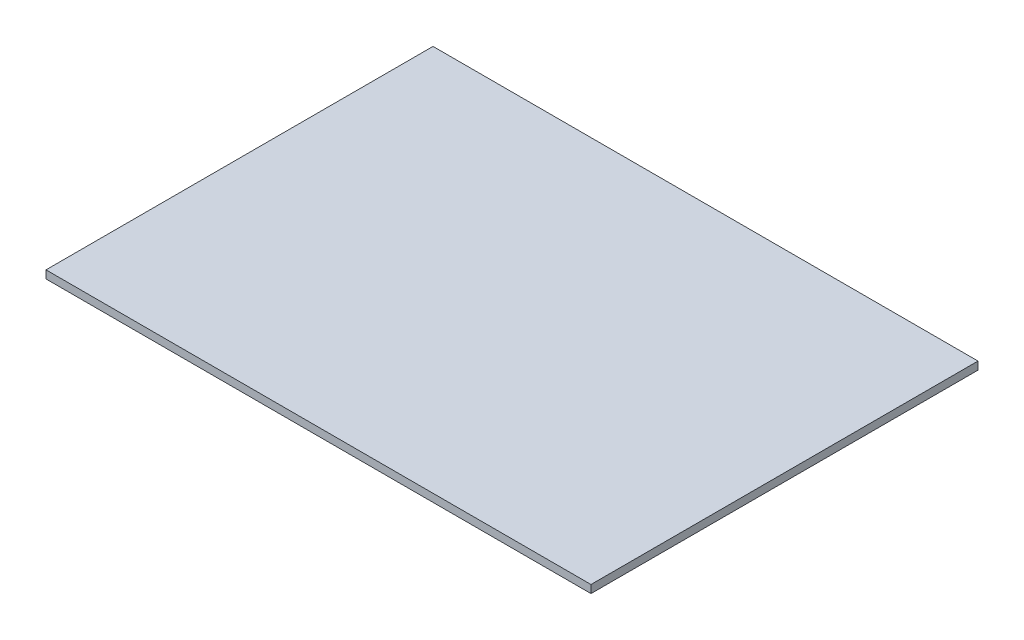
ISO-10303-21;
HEADER;
FILE_DESCRIPTION(('STEP AP214'),'2;1');
FILE_NAME('part.step','',(''),(''),'','','');
FILE_SCHEMA(('AUTOMOTIVE_DESIGN { 1 0 10303 214 1 1 1 1 }'));
ENDSEC;
DATA;
#1=APPLICATION_CONTEXT('core data for automotive mechanical design processes');
#2=APPLICATION_PROTOCOL_DEFINITION('international standard','automotive_design',2000,#1);
#3=PRODUCT_CONTEXT('',#1,'mechanical');
#4=PRODUCT('Part','Part','',(#3));
#5=PRODUCT_RELATED_PRODUCT_CATEGORY('part','',(#4));
#6=PRODUCT_DEFINITION_FORMATION('','',#4);
#7=PRODUCT_DEFINITION_CONTEXT('part definition',#1,'design');
#8=PRODUCT_DEFINITION('design','',#6,#7);
#9=PRODUCT_DEFINITION_SHAPE('','',#8);
#10=(LENGTH_UNIT() NAMED_UNIT(*) SI_UNIT(.MILLI.,.METRE.));
#11=(NAMED_UNIT(*) PLANE_ANGLE_UNIT() SI_UNIT($,.RADIAN.));
#12=(NAMED_UNIT(*) SI_UNIT($,.STERADIAN.) SOLID_ANGLE_UNIT());
#13=UNCERTAINTY_MEASURE_WITH_UNIT(LENGTH_MEASURE(1.E-05),#10,'distance_accuracy_value','');
#14=(GEOMETRIC_REPRESENTATION_CONTEXT(3) GLOBAL_UNCERTAINTY_ASSIGNED_CONTEXT((#13)) GLOBAL_UNIT_ASSIGNED_CONTEXT((#10,
#11,#12)) REPRESENTATION_CONTEXT('',''));
#15=CARTESIAN_POINT('',(0.,0.,0.));
#16=DIRECTION('',(0.,0.,1.));
#17=DIRECTION('',(1.,0.,0.));
#18=AXIS2_PLACEMENT_3D('',#15,#16,#17);
#19=CARTESIAN_POINT('',(0.,12.7,0.));
#20=DIRECTION('',(1.,0.,0.));
#21=DIRECTION('',(0.,0.,-1.));
#22=AXIS2_PLACEMENT_3D('',#19,#20,#21);
#23=PLANE('',#22);
#24=DIRECTION('',(0.,0.,1.));
#25=VECTOR('',#24,1.);
#26=CARTESIAN_POINT('',(0.,0.,0.));
#27=LINE('',#26,#25);
#28=CARTESIAN_POINT('',(0.,0.,-622.3));
#29=VERTEX_POINT('',#28);
#30=CARTESIAN_POINT('',(0.,0.,0.));
#31=VERTEX_POINT('',#30);
#32=EDGE_CURVE('E107',#29,#31,#27,.T.);
#33=ORIENTED_EDGE('',*,*,#32,.T.);
#34=DIRECTION('',(0.,-1.,0.));
#35=VECTOR('',#34,1.);
#36=CARTESIAN_POINT('',(0.,12.7,0.));
#37=LINE('',#36,#35);
#38=CARTESIAN_POINT('',(0.,12.7,0.));
#39=VERTEX_POINT('',#38);
#40=EDGE_CURVE('E11',#39,#31,#37,.T.);
#41=ORIENTED_EDGE('',*,*,#40,.F.);
#42=DIRECTION('',(0.,0.,1.));
#43=VECTOR('',#42,1.);
#44=CARTESIAN_POINT('',(0.,12.7,0.));
#45=LINE('',#44,#43);
#46=CARTESIAN_POINT('',(0.,12.7,-622.3));
#47=VERTEX_POINT('',#46);
#48=EDGE_CURVE('E91',#47,#39,#45,.T.);
#49=ORIENTED_EDGE('',*,*,#48,.F.);
#50=DIRECTION('',(0.,-1.,0.));
#51=VECTOR('',#50,1.);
#52=CARTESIAN_POINT('',(0.,12.7,-622.3));
#53=LINE('',#52,#51);
#54=EDGE_CURVE('E103',#47,#29,#53,.T.);
#55=ORIENTED_EDGE('',*,*,#54,.T.);
#56=EDGE_LOOP('',(#33,#41,#49,#55));
#57=FACE_BOUND('',#56,.T.);
#58=ADVANCED_FACE('F39',(#57),#23,.F.);
#59=CARTESIAN_POINT('',(0.,12.7,0.));
#60=DIRECTION('',(0.,0.,-1.));
#61=DIRECTION('',(-1.,0.,0.));
#62=AXIS2_PLACEMENT_3D('',#59,#60,#61);
#63=PLANE('',#62);
#64=DIRECTION('',(1.,0.,0.));
#65=VECTOR('',#64,1.);
#66=CARTESIAN_POINT('',(0.,0.,0.));
#67=LINE('',#66,#65);
#68=CARTESIAN_POINT('',(876.3,0.,0.));
#69=VERTEX_POINT('',#68);
#70=EDGE_CURVE('E96',#31,#69,#67,.T.);
#71=ORIENTED_EDGE('',*,*,#70,.T.);
#72=DIRECTION('',(0.,-1.,0.));
#73=VECTOR('',#72,1.);
#74=CARTESIAN_POINT('',(876.3,12.7,0.));
#75=LINE('',#74,#73);
#76=CARTESIAN_POINT('',(876.3,12.7,0.));
#77=VERTEX_POINT('',#76);
#78=EDGE_CURVE('E48',#77,#69,#75,.T.);
#79=ORIENTED_EDGE('',*,*,#78,.F.);
#80=DIRECTION('',(1.,0.,0.));
#81=VECTOR('',#80,1.);
#82=CARTESIAN_POINT('',(0.,12.7,0.));
#83=LINE('',#82,#81);
#84=EDGE_CURVE('E86',#39,#77,#83,.T.);
#85=ORIENTED_EDGE('',*,*,#84,.F.);
#86=ORIENTED_EDGE('',*,*,#40,.T.);
#87=EDGE_LOOP('',(#71,#79,#85,#86));
#88=FACE_BOUND('',#87,.T.);
#89=ADVANCED_FACE('F95',(#88),#63,.F.);
#90=CARTESIAN_POINT('',(876.3,12.7,0.));
#91=DIRECTION('',(-1.,0.,0.));
#92=DIRECTION('',(0.,0.,1.));
#93=AXIS2_PLACEMENT_3D('',#90,#91,#92);
#94=PLANE('',#93);
#95=DIRECTION('',(0.,0.,-1.));
#96=VECTOR('',#95,1.);
#97=CARTESIAN_POINT('',(876.3,0.,0.));
#98=LINE('',#97,#96);
#99=CARTESIAN_POINT('',(876.3,0.,-622.3));
#100=VERTEX_POINT('',#99);
#101=EDGE_CURVE('E73',#69,#100,#98,.T.);
#102=ORIENTED_EDGE('',*,*,#101,.T.);
#103=DIRECTION('',(0.,-1.,0.));
#104=VECTOR('',#103,1.);
#105=CARTESIAN_POINT('',(876.3,12.7,-622.3));
#106=LINE('',#105,#104);
#107=CARTESIAN_POINT('',(876.3,12.7,-622.3));
#108=VERTEX_POINT('',#107);
#109=EDGE_CURVE('E98',#108,#100,#106,.T.);
#110=ORIENTED_EDGE('',*,*,#109,.F.);
#111=DIRECTION('',(0.,0.,-1.));
#112=VECTOR('',#111,1.);
#113=CARTESIAN_POINT('',(876.3,12.7,0.));
#114=LINE('',#113,#112);
#115=EDGE_CURVE('E89',#77,#108,#114,.T.);
#116=ORIENTED_EDGE('',*,*,#115,.F.);
#117=ORIENTED_EDGE('',*,*,#78,.T.);
#118=EDGE_LOOP('',(#102,#110,#116,#117));
#119=FACE_BOUND('',#118,.T.);
#120=ADVANCED_FACE('F99',(#119),#94,.F.);
#121=CARTESIAN_POINT('',(0.,12.7,-622.3));
#122=DIRECTION('',(0.,0.,1.));
#123=DIRECTION('',(1.,0.,0.));
#124=AXIS2_PLACEMENT_3D('',#121,#122,#123);
#125=PLANE('',#124);
#126=DIRECTION('',(-1.,0.,0.));
#127=VECTOR('',#126,1.);
#128=CARTESIAN_POINT('',(0.,0.,-622.3));
#129=LINE('',#128,#127);
#130=EDGE_CURVE('E79',#100,#29,#129,.T.);
#131=ORIENTED_EDGE('',*,*,#130,.T.);
#132=ORIENTED_EDGE('',*,*,#54,.F.);
#133=DIRECTION('',(-1.,0.,0.));
#134=VECTOR('',#133,1.);
#135=CARTESIAN_POINT('',(0.,12.7,-622.3));
#136=LINE('',#135,#134);
#137=EDGE_CURVE('E56',#108,#47,#136,.T.);
#138=ORIENTED_EDGE('',*,*,#137,.F.);
#139=ORIENTED_EDGE('',*,*,#109,.T.);
#140=EDGE_LOOP('',(#131,#132,#138,#139));
#141=FACE_BOUND('',#140,.T.);
#142=ADVANCED_FACE('F120',(#141),#125,.F.);
#143=CARTESIAN_POINT('',(0.,12.7,0.));
#144=DIRECTION('',(0.,-1.,0.));
#145=DIRECTION('',(0.,0.,-1.));
#146=AXIS2_PLACEMENT_3D('',#143,#144,#145);
#147=PLANE('',#146);
#148=ORIENTED_EDGE('',*,*,#48,.T.);
#149=ORIENTED_EDGE('',*,*,#84,.T.);
#150=ORIENTED_EDGE('',*,*,#115,.T.);
#151=ORIENTED_EDGE('',*,*,#137,.T.);
#152=EDGE_LOOP('',(#148,#149,#150,#151));
#153=FACE_BOUND('',#152,.T.);
#154=ADVANCED_FACE('F87',(#153),#147,.F.);
#155=CARTESIAN_POINT('',(0.,0.,0.));
#156=DIRECTION('',(0.,-1.,0.));
#157=DIRECTION('',(0.,0.,-1.));
#158=AXIS2_PLACEMENT_3D('',#155,#156,#157);
#159=PLANE('',#158);
#160=ORIENTED_EDGE('',*,*,#32,.F.);
#161=ORIENTED_EDGE('',*,*,#130,.F.);
#162=ORIENTED_EDGE('',*,*,#101,.F.);
#163=ORIENTED_EDGE('',*,*,#70,.F.);
#164=EDGE_LOOP('',(#160,#161,#162,#163));
#165=FACE_BOUND('',#164,.T.);
#166=ADVANCED_FACE('F123',(#165),#159,.T.);
#167=CLOSED_SHELL('',(#58,#89,#120,#142,#154,#166));
#168=MANIFOLD_SOLID_BREP('B2',#167);
#169=ADVANCED_BREP_SHAPE_REPRESENTATION('',(#18,#168),#14);
#170=SHAPE_DEFINITION_REPRESENTATION(#9,#169);
ENDSEC;
END-ISO-10303-21;
